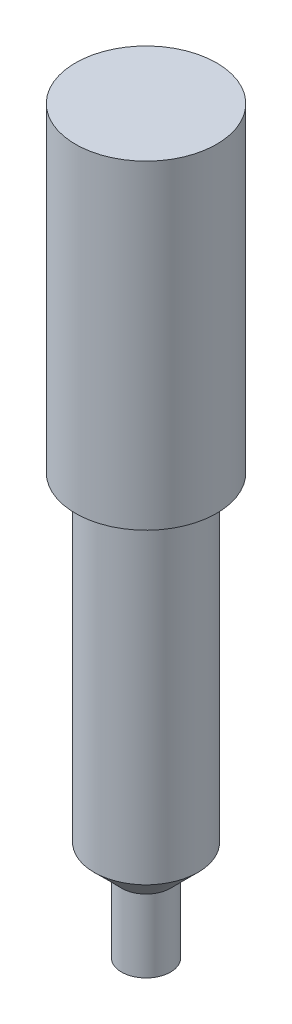
ISO-10303-21;
HEADER;
FILE_DESCRIPTION(('STEP AP214'),'2;1');
FILE_NAME('part.step','',(''),(''),'','','');
FILE_SCHEMA(('AUTOMOTIVE_DESIGN { 1 0 10303 214 1 1 1 1 }'));
ENDSEC;
DATA;
#1=APPLICATION_CONTEXT('core data for automotive mechanical design processes');
#2=APPLICATION_PROTOCOL_DEFINITION('international standard','automotive_design',2000,#1);
#3=PRODUCT_CONTEXT('',#1,'mechanical');
#4=PRODUCT('Part','Part','',(#3));
#5=PRODUCT_RELATED_PRODUCT_CATEGORY('part','',(#4));
#6=PRODUCT_DEFINITION_FORMATION('','',#4);
#7=PRODUCT_DEFINITION_CONTEXT('part definition',#1,'design');
#8=PRODUCT_DEFINITION('design','',#6,#7);
#9=PRODUCT_DEFINITION_SHAPE('','',#8);
#10=(LENGTH_UNIT() NAMED_UNIT(*) SI_UNIT(.MILLI.,.METRE.));
#11=(NAMED_UNIT(*) PLANE_ANGLE_UNIT() SI_UNIT($,.RADIAN.));
#12=(NAMED_UNIT(*) SI_UNIT($,.STERADIAN.) SOLID_ANGLE_UNIT());
#13=UNCERTAINTY_MEASURE_WITH_UNIT(LENGTH_MEASURE(1.E-05),#10,'distance_accuracy_value','');
#14=(GEOMETRIC_REPRESENTATION_CONTEXT(3) GLOBAL_UNCERTAINTY_ASSIGNED_CONTEXT((#13)) GLOBAL_UNIT_ASSIGNED_CONTEXT((#10,
#11,#12)) REPRESENTATION_CONTEXT('',''));
#15=CARTESIAN_POINT('',(0.,0.,0.));
#16=DIRECTION('',(0.,0.,1.));
#17=DIRECTION('',(1.,0.,0.));
#18=AXIS2_PLACEMENT_3D('',#15,#16,#17);
#19=CARTESIAN_POINT('',(0.,0.,0.));
#20=DIRECTION('',(0.,-1.,0.));
#21=DIRECTION('',(0.,0.,-1.));
#22=AXIS2_PLACEMENT_3D('',#19,#20,#21);
#23=PLANE('',#22);
#24=CARTESIAN_POINT('',(0.,0.,0.));
#25=DIRECTION('',(0.,-1.,0.));
#26=DIRECTION('',(0.,0.,-1.));
#27=AXIS2_PLACEMENT_3D('',#24,#25,#26);
#28=CIRCLE('',#27,5.999999938);
#29=CARTESIAN_POINT('',(0.,0.,-5.999999938));
#30=VERTEX_POINT('',#29);
#31=EDGE_CURVE('E58',#30,#30,#28,.T.);
#32=ORIENTED_EDGE('',*,*,#31,.T.);
#33=EDGE_LOOP('',(#32));
#34=FACE_BOUND('',#33,.T.);
#35=ADVANCED_FACE('F46',(#34),#23,.T.);
#36=CARTESIAN_POINT('',(0.,0.,0.));
#37=DIRECTION('',(0.,-1.,0.));
#38=DIRECTION('',(0.,0.,-1.));
#39=AXIS2_PLACEMENT_3D('',#36,#37,#38);
#40=CYLINDRICAL_SURFACE('',#39,5.999999938);
#41=CARTESIAN_POINT('',(0.,17.7799999999999,0.));
#42=DIRECTION('',(0.,-1.,0.));
#43=DIRECTION('',(0.,0.,-1.));
#44=AXIS2_PLACEMENT_3D('',#41,#42,#43);
#45=CIRCLE('',#44,5.999999938);
#46=CARTESIAN_POINT('',(0.,17.7799999999999,-5.999999938));
#47=VERTEX_POINT('',#46);
#48=EDGE_CURVE('E54',#47,#47,#45,.T.);
#49=ORIENTED_EDGE('',*,*,#48,.T.);
#50=EDGE_LOOP('',(#49));
#51=FACE_BOUND('',#50,.T.);
#52=ORIENTED_EDGE('',*,*,#31,.F.);
#53=EDGE_LOOP('',(#52));
#54=FACE_BOUND('',#53,.T.);
#55=ADVANCED_FACE('F88',(#51,#54),#40,.T.);
#56=CARTESIAN_POINT('',(0.,0.,0.));
#57=DIRECTION('',(0.,-1.,0.));
#58=DIRECTION('',(0.,0.,-1.));
#59=AXIS2_PLACEMENT_3D('',#56,#57,#58);
#60=CYLINDRICAL_SURFACE('',#59,12.720955);
#61=CARTESIAN_POINT('',(0.,24.5009550619999,0.));
#62=DIRECTION('',(0.,1.,0.));
#63=DIRECTION('',(0.,0.,1.));
#64=AXIS2_PLACEMENT_3D('',#61,#62,#63);
#65=CIRCLE('',#64,12.720955);
#66=CARTESIAN_POINT('',(0.,24.5009550619999,12.720955));
#67=VERTEX_POINT('',#66);
#68=EDGE_CURVE('E10',#67,#67,#65,.T.);
#69=ORIENTED_EDGE('',*,*,#68,.T.);
#70=EDGE_LOOP('',(#69));
#71=FACE_BOUND('',#70,.T.);
#72=CARTESIAN_POINT('',(0.,102.87,0.));
#73=DIRECTION('',(0.,-1.,0.));
#74=DIRECTION('',(0.,0.,-1.));
#75=AXIS2_PLACEMENT_3D('',#72,#73,#74);
#76=CIRCLE('',#75,12.720955);
#77=CARTESIAN_POINT('',(0.,102.87,-12.720955));
#78=VERTEX_POINT('',#77);
#79=EDGE_CURVE('E62',#78,#78,#76,.T.);
#80=ORIENTED_EDGE('',*,*,#79,.T.);
#81=EDGE_LOOP('',(#80));
#82=FACE_BOUND('',#81,.T.);
#83=ADVANCED_FACE('F93',(#71,#82),#60,.T.);
#84=CARTESIAN_POINT('',(0.,102.87,0.));
#85=DIRECTION('',(0.,-1.,0.));
#86=DIRECTION('',(0.,0.,-1.));
#87=AXIS2_PLACEMENT_3D('',#84,#85,#86);
#88=PLANE('',#87);
#89=CARTESIAN_POINT('',(0.,102.87,0.));
#90=DIRECTION('',(0.,-1.,0.));
#91=DIRECTION('',(0.,0.,-1.));
#92=AXIS2_PLACEMENT_3D('',#89,#90,#91);
#93=CIRCLE('',#92,17.272);
#94=CARTESIAN_POINT('',(0.,102.87,-17.272));
#95=VERTEX_POINT('',#94);
#96=EDGE_CURVE('E67',#95,#95,#93,.T.);
#97=ORIENTED_EDGE('',*,*,#96,.T.);
#98=EDGE_LOOP('',(#97));
#99=FACE_BOUND('',#98,.T.);
#100=ORIENTED_EDGE('',*,*,#79,.F.);
#101=EDGE_LOOP('',(#100));
#102=FACE_BOUND('',#101,.T.);
#103=ADVANCED_FACE('F85',(#99,#102),#88,.T.);
#104=CARTESIAN_POINT('',(0.,0.,0.));
#105=DIRECTION('',(0.,-1.,0.));
#106=DIRECTION('',(0.,0.,-1.));
#107=AXIS2_PLACEMENT_3D('',#104,#105,#106);
#108=CYLINDRICAL_SURFACE('',#107,17.272);
#109=CARTESIAN_POINT('',(0.,181.102,0.));
#110=DIRECTION('',(0.,-1.,0.));
#111=DIRECTION('',(0.,0.,-1.));
#112=AXIS2_PLACEMENT_3D('',#109,#110,#111);
#113=CIRCLE('',#112,17.272);
#114=CARTESIAN_POINT('',(0.,181.102,-17.272));
#115=VERTEX_POINT('',#114);
#116=EDGE_CURVE('E70',#115,#115,#113,.T.);
#117=ORIENTED_EDGE('',*,*,#116,.T.);
#118=EDGE_LOOP('',(#117));
#119=FACE_BOUND('',#118,.T.);
#120=ORIENTED_EDGE('',*,*,#96,.F.);
#121=EDGE_LOOP('',(#120));
#122=FACE_BOUND('',#121,.T.);
#123=ADVANCED_FACE('F74',(#119,#122),#108,.T.);
#124=CARTESIAN_POINT('',(0.,181.102,0.));
#125=DIRECTION('',(0.,-1.,0.));
#126=DIRECTION('',(0.,0.,-1.));
#127=AXIS2_PLACEMENT_3D('',#124,#125,#126);
#128=PLANE('',#127);
#129=ORIENTED_EDGE('',*,*,#116,.F.);
#130=EDGE_LOOP('',(#129));
#131=FACE_BOUND('',#130,.T.);
#132=ADVANCED_FACE('F77',(#131),#128,.F.);
#133=CARTESIAN_POINT('',(0.,17.7799999999999,0.));
#134=DIRECTION('',(0.,1.,0.));
#135=DIRECTION('',(0.,0.,1.));
#136=AXIS2_PLACEMENT_3D('',#133,#134,#135);
#137=CONICAL_SURFACE('',#136,5.999999938,0.785398163397443);
#138=ORIENTED_EDGE('',*,*,#68,.F.);
#139=EDGE_LOOP('',(#138));
#140=FACE_BOUND('',#139,.T.);
#141=ORIENTED_EDGE('',*,*,#48,.F.);
#142=EDGE_LOOP('',(#141));
#143=FACE_BOUND('',#142,.T.);
#144=ADVANCED_FACE('F49',(#140,#143),#137,.T.);
#145=CLOSED_SHELL('',(#35,#55,#83,#103,#123,#132,#144));
#146=MANIFOLD_SOLID_BREP('B2',#145);
#147=ADVANCED_BREP_SHAPE_REPRESENTATION('',(#18,#146),#14);
#148=SHAPE_DEFINITION_REPRESENTATION(#9,#147);
ENDSEC;
END-ISO-10303-21;
